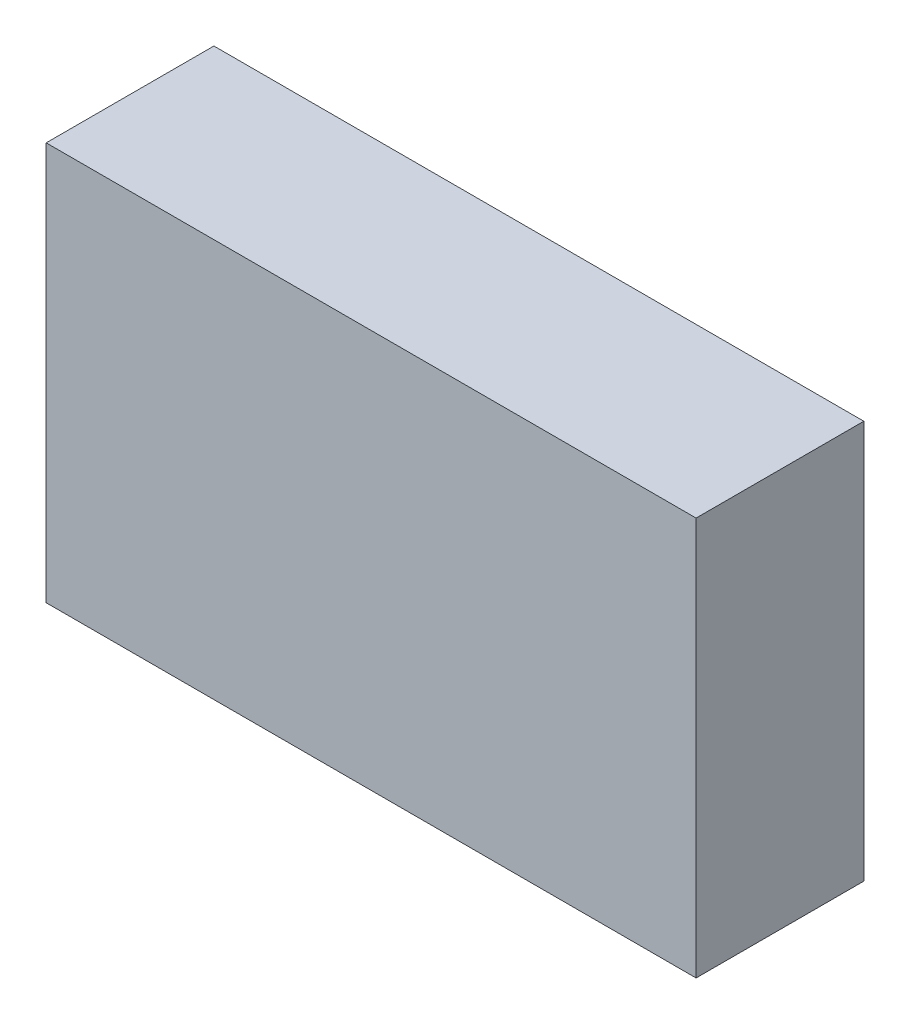
ISO-10303-21;
HEADER;
FILE_DESCRIPTION(('STEP AP214'),'2;1');
FILE_NAME('part.step','',(''),(''),'','','');
FILE_SCHEMA(('AUTOMOTIVE_DESIGN { 1 0 10303 214 1 1 1 1 }'));
ENDSEC;
DATA;
#1=APPLICATION_CONTEXT('core data for automotive mechanical design processes');
#2=APPLICATION_PROTOCOL_DEFINITION('international standard','automotive_design',2000,#1);
#3=PRODUCT_CONTEXT('',#1,'mechanical');
#4=PRODUCT('Part','Part','',(#3));
#5=PRODUCT_RELATED_PRODUCT_CATEGORY('part','',(#4));
#6=PRODUCT_DEFINITION_FORMATION('','',#4);
#7=PRODUCT_DEFINITION_CONTEXT('part definition',#1,'design');
#8=PRODUCT_DEFINITION('design','',#6,#7);
#9=PRODUCT_DEFINITION_SHAPE('','',#8);
#10=(LENGTH_UNIT() NAMED_UNIT(*) SI_UNIT(.MILLI.,.METRE.));
#11=(NAMED_UNIT(*) PLANE_ANGLE_UNIT() SI_UNIT($,.RADIAN.));
#12=(NAMED_UNIT(*) SI_UNIT($,.STERADIAN.) SOLID_ANGLE_UNIT());
#13=UNCERTAINTY_MEASURE_WITH_UNIT(LENGTH_MEASURE(1.E-05),#10,'distance_accuracy_value','');
#14=(GEOMETRIC_REPRESENTATION_CONTEXT(3) GLOBAL_UNCERTAINTY_ASSIGNED_CONTEXT((#13)) GLOBAL_UNIT_ASSIGNED_CONTEXT((#10,
#11,#12)) REPRESENTATION_CONTEXT('',''));
#15=CARTESIAN_POINT('',(0.,0.,0.));
#16=DIRECTION('',(0.,0.,1.));
#17=DIRECTION('',(1.,0.,0.));
#18=AXIS2_PLACEMENT_3D('',#15,#16,#17);
#19=CARTESIAN_POINT('',(0.05,0.,0.45));
#20=DIRECTION('',(0.,0.,1.));
#21=DIRECTION('',(1.,0.,0.));
#22=AXIS2_PLACEMENT_3D('',#19,#20,#21);
#23=PLANE('',#22);
#24=DIRECTION('',(0.,1.,0.));
#25=VECTOR('',#24,1.);
#26=CARTESIAN_POINT('',(1.6,0.,0.45));
#27=LINE('',#26,#25);
#28=CARTESIAN_POINT('',(1.6,0.95,0.45));
#29=VERTEX_POINT('',#28);
#30=CARTESIAN_POINT('',(1.6,0.,0.45));
#31=VERTEX_POINT('',#30);
#32=EDGE_CURVE('E76',#29,#31,#27,.F.);
#33=ORIENTED_EDGE('',*,*,#32,.F.);
#34=DIRECTION('',(1.,0.,0.));
#35=VECTOR('',#34,1.);
#36=CARTESIAN_POINT('',(0.05,0.95,0.45));
#37=LINE('',#36,#35);
#38=CARTESIAN_POINT('',(0.05,0.95,0.45));
#39=VERTEX_POINT('',#38);
#40=EDGE_CURVE('E58',#39,#29,#37,.T.);
#41=ORIENTED_EDGE('',*,*,#40,.F.);
#42=DIRECTION('',(0.,1.,0.));
#43=VECTOR('',#42,1.);
#44=CARTESIAN_POINT('',(0.05,0.,0.45));
#45=LINE('',#44,#43);
#46=CARTESIAN_POINT('',(0.05,0.,0.45));
#47=VERTEX_POINT('',#46);
#48=EDGE_CURVE('E20',#39,#47,#45,.F.);
#49=ORIENTED_EDGE('',*,*,#48,.T.);
#50=DIRECTION('',(1.,0.,0.));
#51=VECTOR('',#50,1.);
#52=CARTESIAN_POINT('',(0.05,0.,0.45));
#53=LINE('',#52,#51);
#54=EDGE_CURVE('E55',#47,#31,#53,.T.);
#55=ORIENTED_EDGE('',*,*,#54,.T.);
#56=EDGE_LOOP('',(#33,#41,#49,#55));
#57=FACE_BOUND('',#56,.T.);
#58=ADVANCED_FACE('F17',(#57),#23,.T.);
#59=CARTESIAN_POINT('',(0.05,0.,0.05));
#60=DIRECTION('',(1.,0.,0.));
#61=DIRECTION('',(0.,0.,-1.));
#62=AXIS2_PLACEMENT_3D('',#59,#60,#61);
#63=PLANE('',#62);
#64=DIRECTION('',(0.,0.,1.));
#65=VECTOR('',#64,1.);
#66=CARTESIAN_POINT('',(0.05,0.95,0.05));
#67=LINE('',#66,#65);
#68=CARTESIAN_POINT('',(0.05,0.95,0.05));
#69=VERTEX_POINT('',#68);
#70=EDGE_CURVE('E78',#69,#39,#67,.T.);
#71=ORIENTED_EDGE('',*,*,#70,.F.);
#72=DIRECTION('',(0.,1.,0.));
#73=VECTOR('',#72,1.);
#74=CARTESIAN_POINT('',(0.05,0.,0.05));
#75=LINE('',#74,#73);
#76=CARTESIAN_POINT('',(0.05,0.,0.05));
#77=VERTEX_POINT('',#76);
#78=EDGE_CURVE('E73',#69,#77,#75,.F.);
#79=ORIENTED_EDGE('',*,*,#78,.T.);
#80=DIRECTION('',(0.,0.,1.));
#81=VECTOR('',#80,1.);
#82=CARTESIAN_POINT('',(0.05,0.,0.05));
#83=LINE('',#82,#81);
#84=EDGE_CURVE('E63',#77,#47,#83,.T.);
#85=ORIENTED_EDGE('',*,*,#84,.T.);
#86=ORIENTED_EDGE('',*,*,#48,.F.);
#87=EDGE_LOOP('',(#71,#79,#85,#86));
#88=FACE_BOUND('',#87,.T.);
#89=ADVANCED_FACE('F72',(#88),#63,.F.);
#90=CARTESIAN_POINT('',(0.05,0.,0.05));
#91=DIRECTION('',(0.,1.,0.));
#92=DIRECTION('',(0.,0.,1.));
#93=AXIS2_PLACEMENT_3D('',#90,#91,#92);
#94=PLANE('',#93);
#95=ORIENTED_EDGE('',*,*,#54,.F.);
#96=ORIENTED_EDGE('',*,*,#84,.F.);
#97=DIRECTION('',(1.,0.,0.));
#98=VECTOR('',#97,1.);
#99=CARTESIAN_POINT('',(0.05,0.,0.05));
#100=LINE('',#99,#98);
#101=CARTESIAN_POINT('',(1.6,0.,0.05));
#102=VERTEX_POINT('',#101);
#103=EDGE_CURVE('E83',#77,#102,#100,.T.);
#104=ORIENTED_EDGE('',*,*,#103,.T.);
#105=DIRECTION('',(0.,0.,-1.));
#106=VECTOR('',#105,1.);
#107=CARTESIAN_POINT('',(1.6,0.,0.05));
#108=LINE('',#107,#106);
#109=EDGE_CURVE('E69',#31,#102,#108,.T.);
#110=ORIENTED_EDGE('',*,*,#109,.F.);
#111=EDGE_LOOP('',(#95,#96,#104,#110));
#112=FACE_BOUND('',#111,.T.);
#113=ADVANCED_FACE('F66',(#112),#94,.F.);
#114=CARTESIAN_POINT('',(1.6,0.,0.05));
#115=DIRECTION('',(1.,0.,0.));
#116=DIRECTION('',(0.,0.,-1.));
#117=AXIS2_PLACEMENT_3D('',#114,#115,#116);
#118=PLANE('',#117);
#119=DIRECTION('',(0.,0.,1.));
#120=VECTOR('',#119,1.);
#121=CARTESIAN_POINT('',(1.6,0.95,0.05));
#122=LINE('',#121,#120);
#123=CARTESIAN_POINT('',(1.6,0.95,0.05));
#124=VERTEX_POINT('',#123);
#125=EDGE_CURVE('E34',#29,#124,#122,.F.);
#126=ORIENTED_EDGE('',*,*,#125,.F.);
#127=ORIENTED_EDGE('',*,*,#32,.T.);
#128=ORIENTED_EDGE('',*,*,#109,.T.);
#129=DIRECTION('',(0.,1.,0.));
#130=VECTOR('',#129,1.);
#131=CARTESIAN_POINT('',(1.6,0.,0.05));
#132=LINE('',#131,#130);
#133=EDGE_CURVE('E26',#102,#124,#132,.T.);
#134=ORIENTED_EDGE('',*,*,#133,.T.);
#135=EDGE_LOOP('',(#126,#127,#128,#134));
#136=FACE_BOUND('',#135,.T.);
#137=ADVANCED_FACE('F88',(#136),#118,.T.);
#138=CARTESIAN_POINT('',(0.05,0.95,0.05));
#139=DIRECTION('',(0.,1.,0.));
#140=DIRECTION('',(0.,0.,1.));
#141=AXIS2_PLACEMENT_3D('',#138,#139,#140);
#142=PLANE('',#141);
#143=ORIENTED_EDGE('',*,*,#40,.T.);
#144=ORIENTED_EDGE('',*,*,#125,.T.);
#145=DIRECTION('',(1.,0.,0.));
#146=VECTOR('',#145,1.);
#147=CARTESIAN_POINT('',(0.05,0.95,0.05));
#148=LINE('',#147,#146);
#149=EDGE_CURVE('E11',#124,#69,#148,.F.);
#150=ORIENTED_EDGE('',*,*,#149,.T.);
#151=ORIENTED_EDGE('',*,*,#70,.T.);
#152=EDGE_LOOP('',(#143,#144,#150,#151));
#153=FACE_BOUND('',#152,.T.);
#154=ADVANCED_FACE('F91',(#153),#142,.T.);
#155=CARTESIAN_POINT('',(0.05,0.,0.05));
#156=DIRECTION('',(0.,0.,1.));
#157=DIRECTION('',(1.,0.,0.));
#158=AXIS2_PLACEMENT_3D('',#155,#156,#157);
#159=PLANE('',#158);
#160=ORIENTED_EDGE('',*,*,#133,.F.);
#161=ORIENTED_EDGE('',*,*,#103,.F.);
#162=ORIENTED_EDGE('',*,*,#78,.F.);
#163=ORIENTED_EDGE('',*,*,#149,.F.);
#164=EDGE_LOOP('',(#160,#161,#162,#163));
#165=FACE_BOUND('',#164,.T.);
#166=ADVANCED_FACE('F90',(#165),#159,.F.);
#167=CLOSED_SHELL('',(#58,#89,#113,#137,#154,#166));
#168=MANIFOLD_SOLID_BREP('B1',#167);
#169=ADVANCED_BREP_SHAPE_REPRESENTATION('',(#18,#168),#14);
#170=SHAPE_DEFINITION_REPRESENTATION(#9,#169);
ENDSEC;
END-ISO-10303-21;
